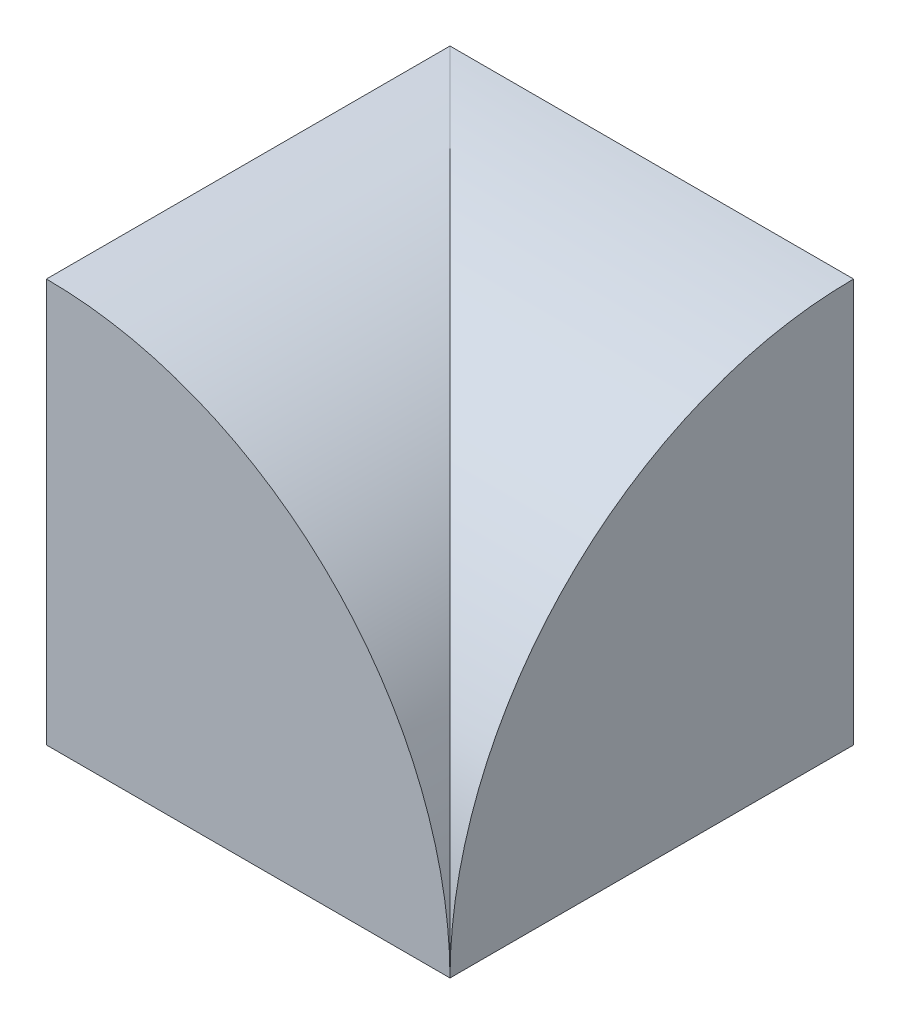
ISO-10303-21;
HEADER;
FILE_DESCRIPTION(('STEP AP214'),'2;1');
FILE_NAME('part.step','',(''),(''),'','','');
FILE_SCHEMA(('AUTOMOTIVE_DESIGN { 1 0 10303 214 1 1 1 1 }'));
ENDSEC;
DATA;
#1=APPLICATION_CONTEXT('core data for automotive mechanical design processes');
#2=APPLICATION_PROTOCOL_DEFINITION('international standard','automotive_design',2000,#1);
#3=PRODUCT_CONTEXT('',#1,'mechanical');
#4=PRODUCT('Part','Part','',(#3));
#5=PRODUCT_RELATED_PRODUCT_CATEGORY('part','',(#4));
#6=PRODUCT_DEFINITION_FORMATION('','',#4);
#7=PRODUCT_DEFINITION_CONTEXT('part definition',#1,'design');
#8=PRODUCT_DEFINITION('design','',#6,#7);
#9=PRODUCT_DEFINITION_SHAPE('','',#8);
#10=(LENGTH_UNIT() NAMED_UNIT(*) SI_UNIT(.MILLI.,.METRE.));
#11=(NAMED_UNIT(*) PLANE_ANGLE_UNIT() SI_UNIT($,.RADIAN.));
#12=(NAMED_UNIT(*) SI_UNIT($,.STERADIAN.) SOLID_ANGLE_UNIT());
#13=UNCERTAINTY_MEASURE_WITH_UNIT(LENGTH_MEASURE(1.E-05),#10,'distance_accuracy_value','');
#14=(GEOMETRIC_REPRESENTATION_CONTEXT(3) GLOBAL_UNCERTAINTY_ASSIGNED_CONTEXT((#13)) GLOBAL_UNIT_ASSIGNED_CONTEXT((#10,
#11,#12)) REPRESENTATION_CONTEXT('',''));
#15=CARTESIAN_POINT('',(0.,0.,0.));
#16=DIRECTION('',(0.,0.,1.));
#17=DIRECTION('',(1.,0.,0.));
#18=AXIS2_PLACEMENT_3D('',#15,#16,#17);
#19=CARTESIAN_POINT('',(0.,0.,20.5));
#20=DIRECTION('',(0.,0.,-1.));
#21=DIRECTION('',(-1.,0.,0.));
#22=AXIS2_PLACEMENT_3D('',#19,#20,#21);
#23=CYLINDRICAL_SURFACE('',#22,20.5);
#24=CARTESIAN_POINT('',(0.,0.,20.5));
#25=DIRECTION('',(0.,0.,1.));
#26=DIRECTION('',(1.,0.,0.));
#27=AXIS2_PLACEMENT_3D('',#24,#25,#26);
#28=CIRCLE('',#27,20.5);
#29=CARTESIAN_POINT('',(20.5,0.,20.5));
#30=VERTEX_POINT('',#29);
#31=CARTESIAN_POINT('',(0.,20.5,20.5));
#32=VERTEX_POINT('',#31);
#33=EDGE_CURVE('E83',#30,#32,#28,.T.);
#34=ORIENTED_EDGE('',*,*,#33,.F.);
#35=CARTESIAN_POINT('',(0.,0.,0.));
#36=DIRECTION('',(0.707106781186547,0.,-0.707106781186547));
#37=DIRECTION('',(-0.707106781186547,0.,-0.707106781186547));
#38=AXIS2_PLACEMENT_3D('',#35,#36,#37);
#39=ELLIPSE('',#38,28.9913780286484,20.5);
#40=CARTESIAN_POINT('',(0.,20.5,0.));
#41=VERTEX_POINT('',#40);
#42=EDGE_CURVE('E60',#30,#41,#39,.F.);
#43=ORIENTED_EDGE('',*,*,#42,.T.);
#44=DIRECTION('',(0.,0.,-1.));
#45=VECTOR('',#44,1.);
#46=CARTESIAN_POINT('',(0.,20.5,20.5));
#47=LINE('',#46,#45);
#48=EDGE_CURVE('E80',#32,#41,#47,.T.);
#49=ORIENTED_EDGE('',*,*,#48,.F.);
#50=EDGE_LOOP('',(#34,#43,#49));
#51=FACE_BOUND('',#50,.T.);
#52=ADVANCED_FACE('F32',(#51),#23,.T.);
#53=CARTESIAN_POINT('',(0.,20.5,20.5));
#54=DIRECTION('',(1.,0.,0.));
#55=DIRECTION('',(0.,1.,0.));
#56=AXIS2_PLACEMENT_3D('',#53,#54,#55);
#57=PLANE('',#56);
#58=ORIENTED_EDGE('',*,*,#48,.T.);
#59=DIRECTION('',(0.,-1.,0.));
#60=VECTOR('',#59,1.);
#61=CARTESIAN_POINT('',(0.,20.5,0.));
#62=LINE('',#61,#60);
#63=CARTESIAN_POINT('',(0.,0.,0.));
#64=VERTEX_POINT('',#63);
#65=EDGE_CURVE('E96',#41,#64,#62,.T.);
#66=ORIENTED_EDGE('',*,*,#65,.T.);
#67=DIRECTION('',(0.,0.,-1.));
#68=VECTOR('',#67,1.);
#69=CARTESIAN_POINT('',(0.,0.,20.5));
#70=LINE('',#69,#68);
#71=CARTESIAN_POINT('',(0.,0.,20.5));
#72=VERTEX_POINT('',#71);
#73=EDGE_CURVE('E82',#72,#64,#70,.T.);
#74=ORIENTED_EDGE('',*,*,#73,.F.);
#75=DIRECTION('',(0.,-1.,0.));
#76=VECTOR('',#75,1.);
#77=CARTESIAN_POINT('',(0.,20.5,20.5));
#78=LINE('',#77,#76);
#79=EDGE_CURVE('E77',#32,#72,#78,.T.);
#80=ORIENTED_EDGE('',*,*,#79,.F.);
#81=EDGE_LOOP('',(#58,#66,#74,#80));
#82=FACE_BOUND('',#81,.T.);
#83=CARTESIAN_POINT('',(0.,10.25,10.25));
#84=DIRECTION('',(-1.,0.,0.));
#85=DIRECTION('',(0.,-1.,0.));
#86=AXIS2_PLACEMENT_3D('',#83,#84,#85);
#87=CIRCLE('',#86,2.5);
#88=CARTESIAN_POINT('',(0.,7.75,10.25));
#89=VERTEX_POINT('',#88);
#90=EDGE_CURVE('E87',#89,#89,#87,.T.);
#91=ORIENTED_EDGE('',*,*,#90,.F.);
#92=EDGE_LOOP('',(#91));
#93=FACE_BOUND('',#92,.T.);
#94=ADVANCED_FACE('F78',(#82,#93),#57,.F.);
#95=CARTESIAN_POINT('',(0.,0.,20.5));
#96=DIRECTION('',(0.,1.,0.));
#97=DIRECTION('',(0.,0.,1.));
#98=AXIS2_PLACEMENT_3D('',#95,#96,#97);
#99=PLANE('',#98);
#100=CARTESIAN_POINT('',(10.25,0.,10.25));
#101=DIRECTION('',(0.,-1.,0.));
#102=DIRECTION('',(0.,0.,-1.));
#103=AXIS2_PLACEMENT_3D('',#100,#101,#102);
#104=CIRCLE('',#103,2.5);
#105=CARTESIAN_POINT('',(10.25,0.,7.75));
#106=VERTEX_POINT('',#105);
#107=EDGE_CURVE('E40',#106,#106,#104,.T.);
#108=ORIENTED_EDGE('',*,*,#107,.F.);
#109=EDGE_LOOP('',(#108));
#110=FACE_BOUND('',#109,.T.);
#111=DIRECTION('',(1.,0.,0.));
#112=VECTOR('',#111,1.);
#113=CARTESIAN_POINT('',(0.,0.,0.));
#114=LINE('',#113,#112);
#115=CARTESIAN_POINT('',(20.5,0.,0.));
#116=VERTEX_POINT('',#115);
#117=EDGE_CURVE('E69',#64,#116,#114,.T.);
#118=ORIENTED_EDGE('',*,*,#117,.T.);
#119=DIRECTION('',(0.,0.,-1.));
#120=VECTOR('',#119,1.);
#121=CARTESIAN_POINT('',(20.5,0.,20.5));
#122=LINE('',#121,#120);
#123=EDGE_CURVE('E90',#30,#116,#122,.T.);
#124=ORIENTED_EDGE('',*,*,#123,.F.);
#125=DIRECTION('',(1.,0.,0.));
#126=VECTOR('',#125,1.);
#127=CARTESIAN_POINT('',(0.,0.,20.5));
#128=LINE('',#127,#126);
#129=EDGE_CURVE('E48',#72,#30,#128,.T.);
#130=ORIENTED_EDGE('',*,*,#129,.F.);
#131=ORIENTED_EDGE('',*,*,#73,.T.);
#132=EDGE_LOOP('',(#118,#124,#130,#131));
#133=FACE_BOUND('',#132,.T.);
#134=ADVANCED_FACE('F134',(#110,#133),#99,.F.);
#135=CARTESIAN_POINT('',(0.,0.,20.5));
#136=DIRECTION('',(0.,0.,1.));
#137=DIRECTION('',(1.,0.,0.));
#138=AXIS2_PLACEMENT_3D('',#135,#136,#137);
#139=PLANE('',#138);
#140=ORIENTED_EDGE('',*,*,#33,.T.);
#141=ORIENTED_EDGE('',*,*,#79,.T.);
#142=ORIENTED_EDGE('',*,*,#129,.T.);
#143=EDGE_LOOP('',(#140,#141,#142));
#144=FACE_BOUND('',#143,.T.);
#145=ADVANCED_FACE('F85',(#144),#139,.T.);
#146=CARTESIAN_POINT('',(0.,0.,0.));
#147=DIRECTION('',(0.,0.,1.));
#148=DIRECTION('',(1.,0.,0.));
#149=AXIS2_PLACEMENT_3D('',#146,#147,#148);
#150=PLANE('',#149);
#151=CARTESIAN_POINT('',(10.25,10.25,0.));
#152=DIRECTION('',(0.,0.,1.));
#153=DIRECTION('',(1.,0.,0.));
#154=AXIS2_PLACEMENT_3D('',#151,#152,#153);
#155=CIRCLE('',#154,2.5);
#156=CARTESIAN_POINT('',(12.75,10.25,0.));
#157=VERTEX_POINT('',#156);
#158=EDGE_CURVE('E11',#157,#157,#155,.F.);
#159=ORIENTED_EDGE('',*,*,#158,.F.);
#160=EDGE_LOOP('',(#159));
#161=FACE_BOUND('',#160,.T.);
#162=ORIENTED_EDGE('',*,*,#65,.F.);
#163=DIRECTION('',(1.,0.,0.));
#164=VECTOR('',#163,1.);
#165=CARTESIAN_POINT('',(0.,20.5,0.));
#166=LINE('',#165,#164);
#167=CARTESIAN_POINT('',(20.5,20.5,0.));
#168=VERTEX_POINT('',#167);
#169=EDGE_CURVE('E112',#41,#168,#166,.T.);
#170=ORIENTED_EDGE('',*,*,#169,.T.);
#171=DIRECTION('',(0.,-1.,0.));
#172=VECTOR('',#171,1.);
#173=CARTESIAN_POINT('',(20.5,0.,0.));
#174=LINE('',#173,#172);
#175=EDGE_CURVE('E110',#168,#116,#174,.T.);
#176=ORIENTED_EDGE('',*,*,#175,.T.);
#177=ORIENTED_EDGE('',*,*,#117,.F.);
#178=EDGE_LOOP('',(#162,#170,#176,#177));
#179=FACE_BOUND('',#178,.T.);
#180=ADVANCED_FACE('F128',(#161,#179),#150,.F.);
#181=CARTESIAN_POINT('',(-2.5,10.25,10.25));
#182=DIRECTION('',(1.,0.,0.));
#183=DIRECTION('',(0.,1.,0.));
#184=AXIS2_PLACEMENT_3D('',#181,#182,#183);
#185=CYLINDRICAL_SURFACE('',#184,2.5);
#186=CARTESIAN_POINT('',(-2.5,10.25,10.25));
#187=DIRECTION('',(-1.,0.,0.));
#188=DIRECTION('',(0.,-1.,0.));
#189=AXIS2_PLACEMENT_3D('',#186,#187,#188);
#190=CIRCLE('',#189,2.5);
#191=CARTESIAN_POINT('',(-2.5,7.75,10.25));
#192=VERTEX_POINT('',#191);
#193=EDGE_CURVE('E98',#192,#192,#190,.T.);
#194=ORIENTED_EDGE('',*,*,#193,.F.);
#195=EDGE_LOOP('',(#194));
#196=FACE_BOUND('',#195,.T.);
#197=ORIENTED_EDGE('',*,*,#90,.T.);
#198=EDGE_LOOP('',(#197));
#199=FACE_BOUND('',#198,.T.);
#200=ADVANCED_FACE('F131',(#196,#199),#185,.T.);
#201=CARTESIAN_POINT('',(-2.5,10.25,10.25));
#202=DIRECTION('',(-1.,0.,0.));
#203=DIRECTION('',(0.,-1.,0.));
#204=AXIS2_PLACEMENT_3D('',#201,#202,#203);
#205=PLANE('',#204);
#206=ORIENTED_EDGE('',*,*,#193,.T.);
#207=EDGE_LOOP('',(#206));
#208=FACE_BOUND('',#207,.T.);
#209=ADVANCED_FACE('F164',(#208),#205,.T.);
#210=CARTESIAN_POINT('',(10.25,-2.5,10.25));
#211=DIRECTION('',(0.,1.,0.));
#212=DIRECTION('',(0.,0.,1.));
#213=AXIS2_PLACEMENT_3D('',#210,#211,#212);
#214=CYLINDRICAL_SURFACE('',#213,2.5);
#215=CARTESIAN_POINT('',(10.25,-2.5,10.25));
#216=DIRECTION('',(0.,-1.,0.));
#217=DIRECTION('',(0.,0.,-1.));
#218=AXIS2_PLACEMENT_3D('',#215,#216,#217);
#219=CIRCLE('',#218,2.5);
#220=CARTESIAN_POINT('',(10.25,-2.5,7.75));
#221=VERTEX_POINT('',#220);
#222=EDGE_CURVE('E102',#221,#221,#219,.T.);
#223=ORIENTED_EDGE('',*,*,#222,.F.);
#224=EDGE_LOOP('',(#223));
#225=FACE_BOUND('',#224,.T.);
#226=ORIENTED_EDGE('',*,*,#107,.T.);
#227=EDGE_LOOP('',(#226));
#228=FACE_BOUND('',#227,.T.);
#229=ADVANCED_FACE('F147',(#225,#228),#214,.T.);
#230=CARTESIAN_POINT('',(10.25,-2.5,10.25));
#231=DIRECTION('',(0.,-1.,0.));
#232=DIRECTION('',(0.,0.,-1.));
#233=AXIS2_PLACEMENT_3D('',#230,#231,#232);
#234=PLANE('',#233);
#235=ORIENTED_EDGE('',*,*,#222,.T.);
#236=EDGE_LOOP('',(#235));
#237=FACE_BOUND('',#236,.T.);
#238=ADVANCED_FACE('F140',(#237),#234,.T.);
#239=CARTESIAN_POINT('',(0.,0.,0.));
#240=DIRECTION('',(-1.,0.,0.));
#241=DIRECTION('',(0.,-1.,0.));
#242=AXIS2_PLACEMENT_3D('',#239,#240,#241);
#243=CYLINDRICAL_SURFACE('',#242,20.5);
#244=ORIENTED_EDGE('',*,*,#42,.F.);
#245=CARTESIAN_POINT('',(20.5,0.,0.));
#246=DIRECTION('',(-1.,0.,0.));
#247=DIRECTION('',(0.,-1.,0.));
#248=AXIS2_PLACEMENT_3D('',#245,#246,#247);
#249=CIRCLE('',#248,20.5);
#250=EDGE_CURVE('E108',#30,#168,#249,.T.);
#251=ORIENTED_EDGE('',*,*,#250,.T.);
#252=ORIENTED_EDGE('',*,*,#169,.F.);
#253=EDGE_LOOP('',(#244,#251,#252));
#254=FACE_BOUND('',#253,.T.);
#255=ADVANCED_FACE('F138',(#254),#243,.T.);
#256=CARTESIAN_POINT('',(20.5,0.,0.));
#257=DIRECTION('',(1.,0.,0.));
#258=DIRECTION('',(0.,1.,0.));
#259=AXIS2_PLACEMENT_3D('',#256,#257,#258);
#260=PLANE('',#259);
#261=ORIENTED_EDGE('',*,*,#175,.F.);
#262=ORIENTED_EDGE('',*,*,#250,.F.);
#263=ORIENTED_EDGE('',*,*,#123,.T.);
#264=EDGE_LOOP('',(#261,#262,#263));
#265=FACE_BOUND('',#264,.T.);
#266=ADVANCED_FACE('F124',(#265),#260,.T.);
#267=CARTESIAN_POINT('',(10.25,10.25,-2.5));
#268=DIRECTION('',(0.,0.,1.));
#269=DIRECTION('',(1.,0.,0.));
#270=AXIS2_PLACEMENT_3D('',#267,#268,#269);
#271=CYLINDRICAL_SURFACE('',#270,2.5);
#272=CARTESIAN_POINT('',(10.25,10.25,-2.5));
#273=DIRECTION('',(0.,0.,-1.));
#274=DIRECTION('',(-1.,0.,0.));
#275=AXIS2_PLACEMENT_3D('',#272,#273,#274);
#276=CIRCLE('',#275,2.5);
#277=CARTESIAN_POINT('',(7.75,10.25,-2.5));
#278=VERTEX_POINT('',#277);
#279=EDGE_CURVE('E115',#278,#278,#276,.T.);
#280=ORIENTED_EDGE('',*,*,#279,.F.);
#281=EDGE_LOOP('',(#280));
#282=FACE_BOUND('',#281,.T.);
#283=ORIENTED_EDGE('',*,*,#158,.T.);
#284=EDGE_LOOP('',(#283));
#285=FACE_BOUND('',#284,.T.);
#286=ADVANCED_FACE('F121',(#282,#285),#271,.T.);
#287=CARTESIAN_POINT('',(10.25,10.25,-2.5));
#288=DIRECTION('',(0.,0.,-1.));
#289=DIRECTION('',(-1.,0.,0.));
#290=AXIS2_PLACEMENT_3D('',#287,#288,#289);
#291=PLANE('',#290);
#292=ORIENTED_EDGE('',*,*,#279,.T.);
#293=EDGE_LOOP('',(#292));
#294=FACE_BOUND('',#293,.T.);
#295=ADVANCED_FACE('F119',(#294),#291,.T.);
#296=CLOSED_SHELL('',(#52,#94,#134,#145,#180,#200,#209,#229,#238,#255,#266,#286,#295));
#297=MANIFOLD_SOLID_BREP('B2',#296);
#298=ADVANCED_BREP_SHAPE_REPRESENTATION('',(#18,#297),#14);
#299=SHAPE_DEFINITION_REPRESENTATION(#9,#298);
ENDSEC;
END-ISO-10303-21;
